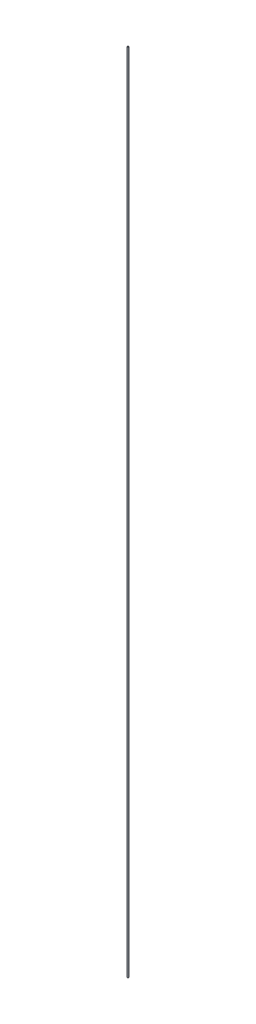
ISO-10303-21;
HEADER;
FILE_DESCRIPTION(('STEP AP214'),'2;1');
FILE_NAME('part.step','',(''),(''),'','','');
FILE_SCHEMA(('AUTOMOTIVE_DESIGN { 1 0 10303 214 1 1 1 1 }'));
ENDSEC;
DATA;
#1=APPLICATION_CONTEXT('core data for automotive mechanical design processes');
#2=APPLICATION_PROTOCOL_DEFINITION('international standard','automotive_design',2000,#1);
#3=PRODUCT_CONTEXT('',#1,'mechanical');
#4=PRODUCT('Part','Part','',(#3));
#5=PRODUCT_RELATED_PRODUCT_CATEGORY('part','',(#4));
#6=PRODUCT_DEFINITION_FORMATION('','',#4);
#7=PRODUCT_DEFINITION_CONTEXT('part definition',#1,'design');
#8=PRODUCT_DEFINITION('design','',#6,#7);
#9=PRODUCT_DEFINITION_SHAPE('','',#8);
#10=(LENGTH_UNIT() NAMED_UNIT(*) SI_UNIT(.MILLI.,.METRE.));
#11=(NAMED_UNIT(*) PLANE_ANGLE_UNIT() SI_UNIT($,.RADIAN.));
#12=(NAMED_UNIT(*) SI_UNIT($,.STERADIAN.) SOLID_ANGLE_UNIT());
#13=UNCERTAINTY_MEASURE_WITH_UNIT(LENGTH_MEASURE(1.E-05),#10,'distance_accuracy_value','');
#14=(GEOMETRIC_REPRESENTATION_CONTEXT(3) GLOBAL_UNCERTAINTY_ASSIGNED_CONTEXT((#13)) GLOBAL_UNIT_ASSIGNED_CONTEXT((#10,
#11,#12)) REPRESENTATION_CONTEXT('',''));
#15=CARTESIAN_POINT('',(0.,0.,0.));
#16=DIRECTION('',(0.,0.,1.));
#17=DIRECTION('',(1.,0.,0.));
#18=AXIS2_PLACEMENT_3D('',#15,#16,#17);
#19=CARTESIAN_POINT('',(0.,0.,0.));
#20=DIRECTION('',(0.,1.,0.));
#21=DIRECTION('',(0.,0.,1.));
#22=AXIS2_PLACEMENT_3D('',#19,#20,#21);
#23=PLANE('',#22);
#24=CARTESIAN_POINT('',(0.,0.,0.));
#25=DIRECTION('',(0.,1.,0.));
#26=DIRECTION('',(0.,0.,1.));
#27=AXIS2_PLACEMENT_3D('',#24,#25,#26);
#28=CIRCLE('',#27,6.35);
#29=CARTESIAN_POINT('',(0.,0.,6.35));
#30=VERTEX_POINT('',#29);
#31=EDGE_CURVE('E47',#30,#30,#28,.T.);
#32=ORIENTED_EDGE('',*,*,#31,.F.);
#33=EDGE_LOOP('',(#32));
#34=FACE_BOUND('',#33,.T.);
#35=ADVANCED_FACE('F41',(#34),#23,.F.);
#36=CARTESIAN_POINT('',(0.,8507.984,0.));
#37=DIRECTION('',(0.,1.,0.));
#38=DIRECTION('',(0.,0.,1.));
#39=AXIS2_PLACEMENT_3D('',#36,#37,#38);
#40=PLANE('',#39);
#41=CARTESIAN_POINT('',(0.,8507.984,0.));
#42=DIRECTION('',(0.,1.,0.));
#43=DIRECTION('',(0.,0.,1.));
#44=AXIS2_PLACEMENT_3D('',#41,#42,#43);
#45=CIRCLE('',#44,6.35);
#46=CARTESIAN_POINT('',(0.,8507.984,6.35));
#47=VERTEX_POINT('',#46);
#48=EDGE_CURVE('E11',#47,#47,#45,.T.);
#49=ORIENTED_EDGE('',*,*,#48,.T.);
#50=EDGE_LOOP('',(#49));
#51=FACE_BOUND('',#50,.T.);
#52=ADVANCED_FACE('F56',(#51),#40,.T.);
#53=CARTESIAN_POINT('',(0.,0.,0.));
#54=DIRECTION('',(0.,1.,0.));
#55=DIRECTION('',(0.,0.,1.));
#56=AXIS2_PLACEMENT_3D('',#53,#54,#55);
#57=CYLINDRICAL_SURFACE('',#56,6.35);
#58=ORIENTED_EDGE('',*,*,#48,.F.);
#59=EDGE_LOOP('',(#58));
#60=FACE_BOUND('',#59,.T.);
#61=ORIENTED_EDGE('',*,*,#31,.T.);
#62=EDGE_LOOP('',(#61));
#63=FACE_BOUND('',#62,.T.);
#64=ADVANCED_FACE('F53',(#60,#63),#57,.T.);
#65=CLOSED_SHELL('',(#35,#52,#64));
#66=MANIFOLD_SOLID_BREP('B2',#65);
#67=ADVANCED_BREP_SHAPE_REPRESENTATION('',(#18,#66),#14);
#68=SHAPE_DEFINITION_REPRESENTATION(#9,#67);
ENDSEC;
END-ISO-10303-21;
